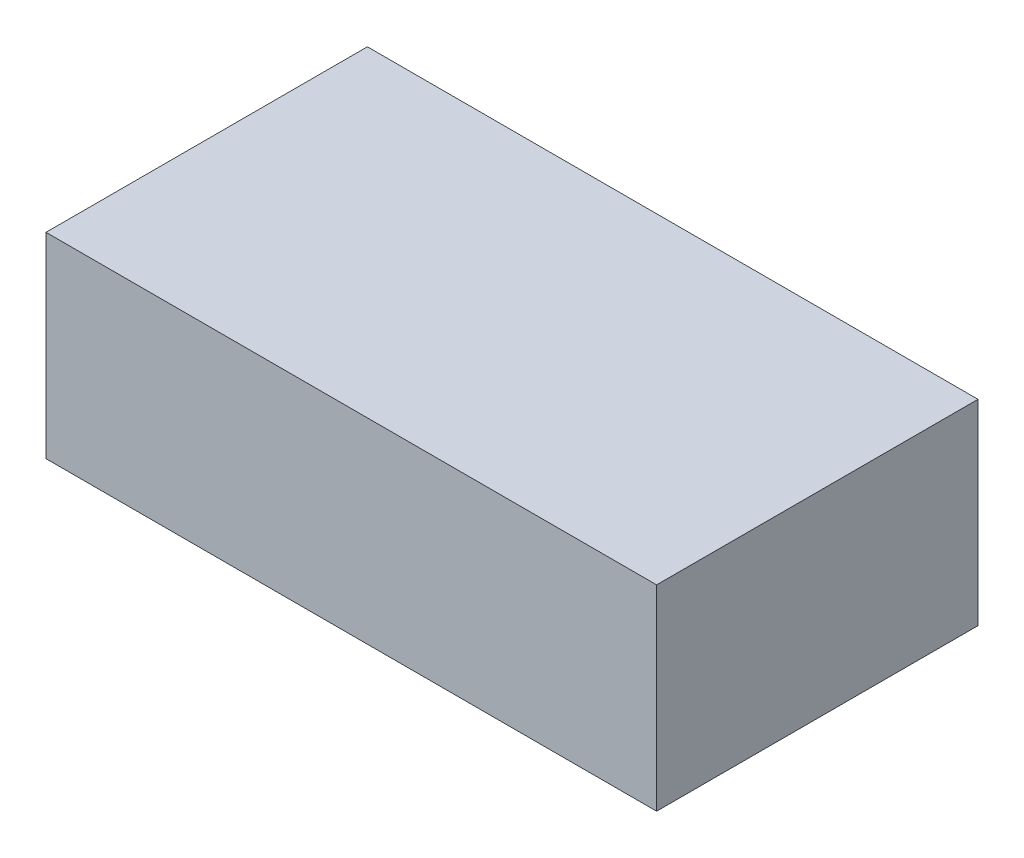
ISO-10303-21;
HEADER;
FILE_DESCRIPTION(('STEP AP214'),'2;1');
FILE_NAME('part.step','',(''),(''),'','','');
FILE_SCHEMA(('AUTOMOTIVE_DESIGN { 1 0 10303 214 1 1 1 1 }'));
ENDSEC;
DATA;
#1=APPLICATION_CONTEXT('core data for automotive mechanical design processes');
#2=APPLICATION_PROTOCOL_DEFINITION('international standard','automotive_design',2000,#1);
#3=PRODUCT_CONTEXT('',#1,'mechanical');
#4=PRODUCT('Part','Part','',(#3));
#5=PRODUCT_RELATED_PRODUCT_CATEGORY('part','',(#4));
#6=PRODUCT_DEFINITION_FORMATION('','',#4);
#7=PRODUCT_DEFINITION_CONTEXT('part definition',#1,'design');
#8=PRODUCT_DEFINITION('design','',#6,#7);
#9=PRODUCT_DEFINITION_SHAPE('','',#8);
#10=(LENGTH_UNIT() NAMED_UNIT(*) SI_UNIT(.MILLI.,.METRE.));
#11=(NAMED_UNIT(*) PLANE_ANGLE_UNIT() SI_UNIT($,.RADIAN.));
#12=(NAMED_UNIT(*) SI_UNIT($,.STERADIAN.) SOLID_ANGLE_UNIT());
#13=UNCERTAINTY_MEASURE_WITH_UNIT(LENGTH_MEASURE(1.E-05),#10,'distance_accuracy_value','');
#14=(GEOMETRIC_REPRESENTATION_CONTEXT(3) GLOBAL_UNCERTAINTY_ASSIGNED_CONTEXT((#13)) GLOBAL_UNIT_ASSIGNED_CONTEXT((#10,
#11,#12)) REPRESENTATION_CONTEXT('',''));
#15=CARTESIAN_POINT('',(0.,0.,0.));
#16=DIRECTION('',(0.,0.,1.));
#17=DIRECTION('',(1.,0.,0.));
#18=AXIS2_PLACEMENT_3D('',#15,#16,#17);
#19=CARTESIAN_POINT('',(-48.26,15.494,0.));
#20=DIRECTION('',(1.,0.,0.));
#21=DIRECTION('',(0.,0.,-1.));
#22=AXIS2_PLACEMENT_3D('',#19,#20,#21);
#23=PLANE('',#22);
#24=DIRECTION('',(0.,0.,1.));
#25=VECTOR('',#24,1.);
#26=CARTESIAN_POINT('',(-48.26,0.,0.));
#27=LINE('',#26,#25);
#28=CARTESIAN_POINT('',(-48.26,0.,0.));
#29=VERTEX_POINT('',#28);
#30=CARTESIAN_POINT('',(-48.26,0.,25.4));
#31=VERTEX_POINT('',#30);
#32=EDGE_CURVE('E97',#29,#31,#27,.T.);
#33=ORIENTED_EDGE('',*,*,#32,.T.);
#34=DIRECTION('',(0.,-1.,0.));
#35=VECTOR('',#34,1.);
#36=CARTESIAN_POINT('',(-48.26,15.494,25.4));
#37=LINE('',#36,#35);
#38=CARTESIAN_POINT('',(-48.26,15.494,25.4));
#39=VERTEX_POINT('',#38);
#40=EDGE_CURVE('E11',#39,#31,#37,.T.);
#41=ORIENTED_EDGE('',*,*,#40,.F.);
#42=DIRECTION('',(0.,0.,1.));
#43=VECTOR('',#42,1.);
#44=CARTESIAN_POINT('',(-48.26,15.494,0.));
#45=LINE('',#44,#43);
#46=CARTESIAN_POINT('',(-48.26,15.494,0.));
#47=VERTEX_POINT('',#46);
#48=EDGE_CURVE('E85',#47,#39,#45,.T.);
#49=ORIENTED_EDGE('',*,*,#48,.F.);
#50=DIRECTION('',(0.,-1.,0.));
#51=VECTOR('',#50,1.);
#52=CARTESIAN_POINT('',(-48.26,15.494,0.));
#53=LINE('',#52,#51);
#54=EDGE_CURVE('E93',#47,#29,#53,.T.);
#55=ORIENTED_EDGE('',*,*,#54,.T.);
#56=EDGE_LOOP('',(#33,#41,#49,#55));
#57=FACE_BOUND('',#56,.T.);
#58=ADVANCED_FACE('F34',(#57),#23,.F.);
#59=CARTESIAN_POINT('',(-48.26,15.494,25.4));
#60=DIRECTION('',(0.,0.,-1.));
#61=DIRECTION('',(-1.,0.,0.));
#62=AXIS2_PLACEMENT_3D('',#59,#60,#61);
#63=PLANE('',#62);
#64=DIRECTION('',(1.,0.,0.));
#65=VECTOR('',#64,1.);
#66=CARTESIAN_POINT('',(-48.26,0.,25.4));
#67=LINE('',#66,#65);
#68=CARTESIAN_POINT('',(0.,0.,25.4));
#69=VERTEX_POINT('',#68);
#70=EDGE_CURVE('E89',#31,#69,#67,.T.);
#71=ORIENTED_EDGE('',*,*,#70,.T.);
#72=DIRECTION('',(0.,-1.,0.));
#73=VECTOR('',#72,1.);
#74=CARTESIAN_POINT('',(0.,15.494,25.4));
#75=LINE('',#74,#73);
#76=CARTESIAN_POINT('',(0.,15.494,25.4));
#77=VERTEX_POINT('',#76);
#78=EDGE_CURVE('E42',#77,#69,#75,.T.);
#79=ORIENTED_EDGE('',*,*,#78,.F.);
#80=DIRECTION('',(1.,0.,0.));
#81=VECTOR('',#80,1.);
#82=CARTESIAN_POINT('',(-48.26,15.494,25.4));
#83=LINE('',#82,#81);
#84=EDGE_CURVE('E80',#39,#77,#83,.T.);
#85=ORIENTED_EDGE('',*,*,#84,.F.);
#86=ORIENTED_EDGE('',*,*,#40,.T.);
#87=EDGE_LOOP('',(#71,#79,#85,#86));
#88=FACE_BOUND('',#87,.T.);
#89=ADVANCED_FACE('F88',(#88),#63,.F.);
#90=CARTESIAN_POINT('',(0.,15.494,0.));
#91=DIRECTION('',(-1.,0.,0.));
#92=DIRECTION('',(0.,0.,1.));
#93=AXIS2_PLACEMENT_3D('',#90,#91,#92);
#94=PLANE('',#93);
#95=DIRECTION('',(0.,0.,-1.));
#96=VECTOR('',#95,1.);
#97=CARTESIAN_POINT('',(0.,0.,0.));
#98=LINE('',#97,#96);
#99=CARTESIAN_POINT('',(0.,0.,0.));
#100=VERTEX_POINT('',#99);
#101=EDGE_CURVE('E67',#69,#100,#98,.T.);
#102=ORIENTED_EDGE('',*,*,#101,.T.);
#103=DIRECTION('',(0.,-1.,0.));
#104=VECTOR('',#103,1.);
#105=CARTESIAN_POINT('',(0.,15.494,0.));
#106=LINE('',#105,#104);
#107=CARTESIAN_POINT('',(0.,15.494,0.));
#108=VERTEX_POINT('',#107);
#109=EDGE_CURVE('E90',#108,#100,#106,.T.);
#110=ORIENTED_EDGE('',*,*,#109,.F.);
#111=DIRECTION('',(0.,0.,-1.));
#112=VECTOR('',#111,1.);
#113=CARTESIAN_POINT('',(0.,15.494,0.));
#114=LINE('',#113,#112);
#115=EDGE_CURVE('E83',#77,#108,#114,.T.);
#116=ORIENTED_EDGE('',*,*,#115,.F.);
#117=ORIENTED_EDGE('',*,*,#78,.T.);
#118=EDGE_LOOP('',(#102,#110,#116,#117));
#119=FACE_BOUND('',#118,.T.);
#120=ADVANCED_FACE('F91',(#119),#94,.F.);
#121=CARTESIAN_POINT('',(-48.26,15.494,0.));
#122=DIRECTION('',(0.,0.,1.));
#123=DIRECTION('',(1.,0.,0.));
#124=AXIS2_PLACEMENT_3D('',#121,#122,#123);
#125=PLANE('',#124);
#126=DIRECTION('',(-1.,0.,0.));
#127=VECTOR('',#126,1.);
#128=CARTESIAN_POINT('',(-48.26,0.,0.));
#129=LINE('',#128,#127);
#130=EDGE_CURVE('E73',#100,#29,#129,.T.);
#131=ORIENTED_EDGE('',*,*,#130,.T.);
#132=ORIENTED_EDGE('',*,*,#54,.F.);
#133=DIRECTION('',(-1.,0.,0.));
#134=VECTOR('',#133,1.);
#135=CARTESIAN_POINT('',(-48.26,15.494,0.));
#136=LINE('',#135,#134);
#137=EDGE_CURVE('E50',#108,#47,#136,.T.);
#138=ORIENTED_EDGE('',*,*,#137,.F.);
#139=ORIENTED_EDGE('',*,*,#109,.T.);
#140=EDGE_LOOP('',(#131,#132,#138,#139));
#141=FACE_BOUND('',#140,.T.);
#142=ADVANCED_FACE('F104',(#141),#125,.F.);
#143=CARTESIAN_POINT('',(-48.26,15.494,25.4));
#144=DIRECTION('',(0.,1.,0.));
#145=DIRECTION('',(0.,0.,1.));
#146=AXIS2_PLACEMENT_3D('',#143,#144,#145);
#147=PLANE('',#146);
#148=ORIENTED_EDGE('',*,*,#48,.T.);
#149=ORIENTED_EDGE('',*,*,#84,.T.);
#150=ORIENTED_EDGE('',*,*,#115,.T.);
#151=ORIENTED_EDGE('',*,*,#137,.T.);
#152=EDGE_LOOP('',(#148,#149,#150,#151));
#153=FACE_BOUND('',#152,.T.);
#154=ADVANCED_FACE('F81',(#153),#147,.T.);
#155=CARTESIAN_POINT('',(-48.26,0.,25.4));
#156=DIRECTION('',(0.,1.,0.));
#157=DIRECTION('',(0.,0.,1.));
#158=AXIS2_PLACEMENT_3D('',#155,#156,#157);
#159=PLANE('',#158);
#160=ORIENTED_EDGE('',*,*,#32,.F.);
#161=ORIENTED_EDGE('',*,*,#130,.F.);
#162=ORIENTED_EDGE('',*,*,#101,.F.);
#163=ORIENTED_EDGE('',*,*,#70,.F.);
#164=EDGE_LOOP('',(#160,#161,#162,#163));
#165=FACE_BOUND('',#164,.T.);
#166=ADVANCED_FACE('F107',(#165),#159,.F.);
#167=CLOSED_SHELL('',(#58,#89,#120,#142,#154,#166));
#168=MANIFOLD_SOLID_BREP('B2',#167);
#169=ADVANCED_BREP_SHAPE_REPRESENTATION('',(#18,#168),#14);
#170=SHAPE_DEFINITION_REPRESENTATION(#9,#169);
ENDSEC;
END-ISO-10303-21;
